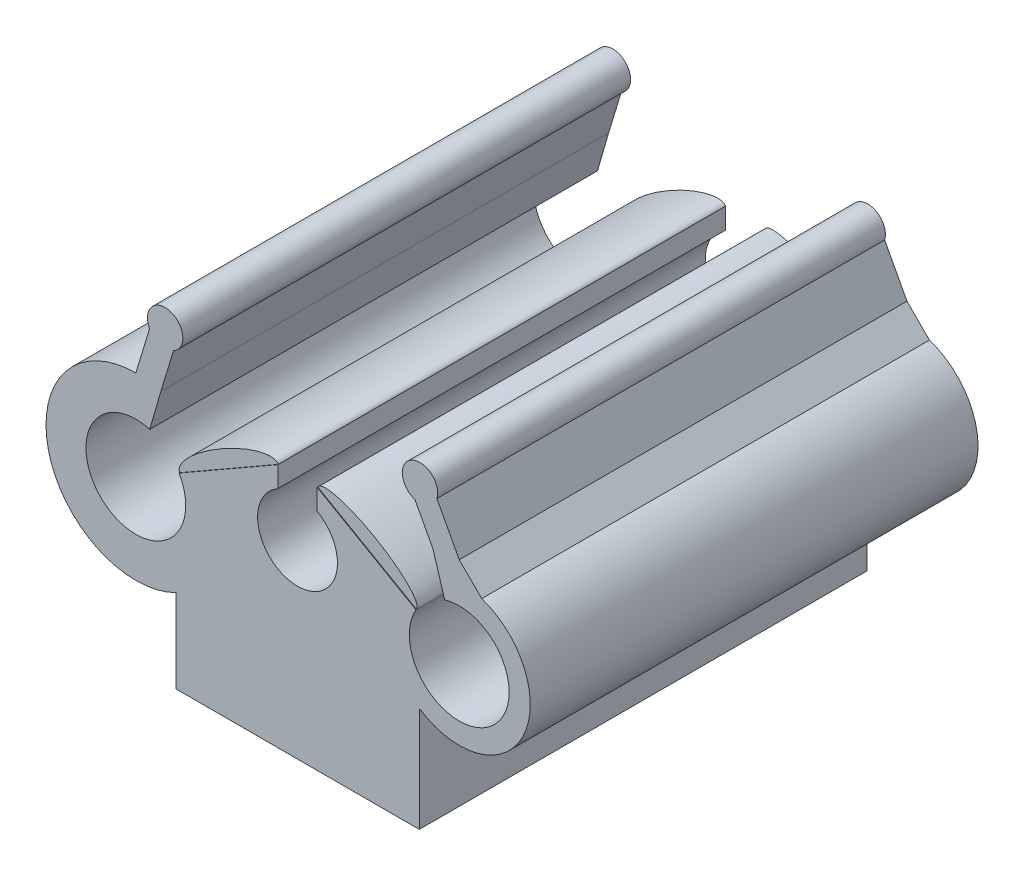
ISO-10303-21;
HEADER;
FILE_DESCRIPTION(('STEP AP214'),'2;1');
FILE_NAME('part.step','',(''),(''),'','','');
FILE_SCHEMA(('AUTOMOTIVE_DESIGN { 1 0 10303 214 1 1 1 1 }'));
ENDSEC;
DATA;
#1=APPLICATION_CONTEXT('core data for automotive mechanical design processes');
#2=APPLICATION_PROTOCOL_DEFINITION('international standard','automotive_design',2000,#1);
#3=PRODUCT_CONTEXT('',#1,'mechanical');
#4=PRODUCT('Part','Part','',(#3));
#5=PRODUCT_RELATED_PRODUCT_CATEGORY('part','',(#4));
#6=PRODUCT_DEFINITION_FORMATION('','',#4);
#7=PRODUCT_DEFINITION_CONTEXT('part definition',#1,'design');
#8=PRODUCT_DEFINITION('design','',#6,#7);
#9=PRODUCT_DEFINITION_SHAPE('','',#8);
#10=(LENGTH_UNIT() NAMED_UNIT(*) SI_UNIT(.MILLI.,.METRE.));
#11=(NAMED_UNIT(*) PLANE_ANGLE_UNIT() SI_UNIT($,.RADIAN.));
#12=(NAMED_UNIT(*) SI_UNIT($,.STERADIAN.) SOLID_ANGLE_UNIT());
#13=UNCERTAINTY_MEASURE_WITH_UNIT(LENGTH_MEASURE(1.E-05),#10,'distance_accuracy_value','');
#14=(GEOMETRIC_REPRESENTATION_CONTEXT(3) GLOBAL_UNCERTAINTY_ASSIGNED_CONTEXT((#13)) GLOBAL_UNIT_ASSIGNED_CONTEXT((#10,
#11,#12)) REPRESENTATION_CONTEXT('',''));
#15=CARTESIAN_POINT('',(0.,0.,0.));
#16=DIRECTION('',(0.,0.,1.));
#17=DIRECTION('',(1.,0.,0.));
#18=AXIS2_PLACEMENT_3D('',#15,#16,#17);
#19=CARTESIAN_POINT('',(-4.03325038650778,7.03417656127752,22.43));
#20=DIRECTION('',(-0.497414045158443,0.867513266572399,0.));
#21=DIRECTION('',(-0.867513266572399,-0.497414045158443,0.));
#22=AXIS2_PLACEMENT_3D('',#19,#20,#21);
#23=PLANE('',#22);
#24=DIRECTION('',(0.,0.,-1.));
#25=VECTOR('',#24,1.);
#26=CARTESIAN_POINT('',(5.11360878589365,12.2787951702992,22.43));
#27=LINE('',#26,#25);
#28=CARTESIAN_POINT('',(5.11360878589365,12.2787951702992,22.43));
#29=VERTEX_POINT('',#28);
#30=CARTESIAN_POINT('',(5.11360878589367,12.2787951702992,22.4));
#31=VERTEX_POINT('',#30);
#32=EDGE_CURVE('E53',#29,#31,#27,.T.);
#33=ORIENTED_EDGE('',*,*,#32,.T.);
#34=DIRECTION('',(-0.867513266572399,-0.497414045158444,0.));
#35=VECTOR('',#34,1.);
#36=CARTESIAN_POINT('',(5.11360878589367,12.2787951702992,22.4));
#37=LINE('',#36,#35);
#38=CARTESIAN_POINT('',(0.168783166430996,9.44353511289611,22.4));
#39=VERTEX_POINT('',#38);
#40=EDGE_CURVE('E374',#31,#39,#37,.T.);
#41=ORIENTED_EDGE('',*,*,#40,.T.);
#42=DIRECTION('',(0.,0.,-1.));
#43=VECTOR('',#42,1.);
#44=CARTESIAN_POINT('',(0.168783166431,9.4435351128961,22.43));
#45=LINE('',#44,#43);
#46=CARTESIAN_POINT('',(0.168783166431,9.4435351128961,22.43));
#47=VERTEX_POINT('',#46);
#48=EDGE_CURVE('E387',#47,#39,#45,.T.);
#49=ORIENTED_EDGE('',*,*,#48,.F.);
#50=DIRECTION('',(0.867513266572399,0.497414045158443,0.));
#51=VECTOR('',#50,1.);
#52=CARTESIAN_POINT('',(-4.03325038650778,7.03417656127752,22.43));
#53=LINE('',#52,#51);
#54=EDGE_CURVE('E467',#47,#29,#53,.T.);
#55=ORIENTED_EDGE('',*,*,#54,.T.);
#56=EDGE_LOOP('',(#33,#41,#49,#55));
#57=FACE_BOUND('',#56,.T.);
#58=ADVANCED_FACE('F43',(#57),#23,.T.);
#59=CARTESIAN_POINT('',(7.05178332082262,12.2986386157611,22.43));
#60=DIRECTION('',(0.497414045158445,0.867513266572398,0.));
#61=DIRECTION('',(-0.867513266572398,0.497414045158445,0.));
#62=AXIS2_PLACEMENT_3D('',#59,#60,#61);
#63=PLANE('',#62);
#64=DIRECTION('',(0.,0.,-1.));
#65=VECTOR('',#64,1.);
#66=CARTESIAN_POINT('',(12.031216833569,9.44353511289611,22.43));
#67=LINE('',#66,#65);
#68=CARTESIAN_POINT('',(12.031216833569,9.44353511289611,22.43));
#69=VERTEX_POINT('',#68);
#70=CARTESIAN_POINT('',(12.031216833569,9.44353511289611,22.4));
#71=VERTEX_POINT('',#70);
#72=EDGE_CURVE('E177',#69,#71,#67,.T.);
#73=ORIENTED_EDGE('',*,*,#72,.T.);
#74=DIRECTION('',(-0.867513266572399,0.497414045158443,0.));
#75=VECTOR('',#74,1.);
#76=CARTESIAN_POINT('',(12.031216833569,9.44353511289611,22.4));
#77=LINE('',#76,#75);
#78=CARTESIAN_POINT('',(7.08639121410632,12.2787951702992,22.4));
#79=VERTEX_POINT('',#78);
#80=EDGE_CURVE('E264',#71,#79,#77,.T.);
#81=ORIENTED_EDGE('',*,*,#80,.T.);
#82=DIRECTION('',(0.,0.,-1.));
#83=VECTOR('',#82,1.);
#84=CARTESIAN_POINT('',(7.08639121410632,12.2787951702992,22.43));
#85=LINE('',#84,#83);
#86=CARTESIAN_POINT('',(7.08639121410632,12.2787951702992,22.43));
#87=VERTEX_POINT('',#86);
#88=EDGE_CURVE('E188',#87,#79,#85,.T.);
#89=ORIENTED_EDGE('',*,*,#88,.F.);
#90=DIRECTION('',(0.867513266572398,-0.497414045158445,0.));
#91=VECTOR('',#90,1.);
#92=CARTESIAN_POINT('',(7.05178332082262,12.2986386157611,22.43));
#93=LINE('',#92,#91);
#94=EDGE_CURVE('E192',#87,#69,#93,.T.);
#95=ORIENTED_EDGE('',*,*,#94,.T.);
#96=EDGE_LOOP('',(#73,#81,#89,#95));
#97=FACE_BOUND('',#96,.T.);
#98=ADVANCED_FACE('F197',(#97),#63,.T.);
#99=CARTESIAN_POINT('',(6.1,9.5,22.43));
#100=DIRECTION('',(0.,0.,-1.));
#101=DIRECTION('',(-1.,0.,0.));
#102=AXIS2_PLACEMENT_3D('',#99,#100,#101);
#103=CYLINDRICAL_SURFACE('',#102,2.);
#104=CARTESIAN_POINT('',(6.1,9.5,0.));
#105=DIRECTION('',(0.,0.,1.));
#106=DIRECTION('',(1.,0.,0.));
#107=AXIS2_PLACEMENT_3D('',#104,#105,#106);
#108=CIRCLE('',#107,2.);
#109=CARTESIAN_POINT('',(5.11360878589367,11.2398368810707,0.));
#110=VERTEX_POINT('',#109);
#111=CARTESIAN_POINT('',(7.08639121410632,11.2398368810707,0.));
#112=VERTEX_POINT('',#111);
#113=EDGE_CURVE('E203',#110,#112,#108,.T.);
#114=ORIENTED_EDGE('',*,*,#113,.F.);
#115=DIRECTION('',(0.,0.,-1.));
#116=VECTOR('',#115,1.);
#117=CARTESIAN_POINT('',(5.11360878589367,11.2398368810707,22.43));
#118=LINE('',#117,#116);
#119=CARTESIAN_POINT('',(5.11360878589367,11.2398368810707,22.43));
#120=VERTEX_POINT('',#119);
#121=EDGE_CURVE('E11',#120,#110,#118,.T.);
#122=ORIENTED_EDGE('',*,*,#121,.F.);
#123=CARTESIAN_POINT('',(6.1,9.5,22.43));
#124=DIRECTION('',(0.,0.,1.));
#125=DIRECTION('',(1.,0.,0.));
#126=AXIS2_PLACEMENT_3D('',#123,#124,#125);
#127=CIRCLE('',#126,2.);
#128=CARTESIAN_POINT('',(7.08639121410632,11.2398368810707,22.43));
#129=VERTEX_POINT('',#128);
#130=EDGE_CURVE('E247',#120,#129,#127,.T.);
#131=ORIENTED_EDGE('',*,*,#130,.T.);
#132=DIRECTION('',(0.,0.,-1.));
#133=VECTOR('',#132,1.);
#134=CARTESIAN_POINT('',(7.08639121410632,11.2398368810707,22.43));
#135=LINE('',#134,#133);
#136=EDGE_CURVE('E123',#129,#112,#135,.T.);
#137=ORIENTED_EDGE('',*,*,#136,.T.);
#138=EDGE_LOOP('',(#114,#122,#131,#137));
#139=FACE_BOUND('',#138,.T.);
#140=ADVANCED_FACE('F45',(#139),#103,.F.);
#141=CARTESIAN_POINT('',(5.1136087858938,0.,22.43));
#142=DIRECTION('',(1.,0.,0.));
#143=DIRECTION('',(0.,1.,0.));
#144=AXIS2_PLACEMENT_3D('',#141,#142,#143);
#145=PLANE('',#144);
#146=DIRECTION('',(0.,-1.,0.));
#147=VECTOR('',#146,1.);
#148=CARTESIAN_POINT('',(5.1136087858938,0.,0.));
#149=LINE('',#148,#147);
#150=CARTESIAN_POINT('',(5.11360878589365,12.2787951702992,0.));
#151=VERTEX_POINT('',#150);
#152=EDGE_CURVE('E206',#151,#110,#149,.T.);
#153=ORIENTED_EDGE('',*,*,#152,.F.);
#154=DIRECTION('',(0.,0.,-1.));
#155=VECTOR('',#154,1.);
#156=CARTESIAN_POINT('',(5.11360878589367,12.2787951702992,22.4));
#157=LINE('',#156,#155);
#158=EDGE_CURVE('E358',#31,#151,#157,.T.);
#159=ORIENTED_EDGE('',*,*,#158,.F.);
#160=ORIENTED_EDGE('',*,*,#32,.F.);
#161=DIRECTION('',(0.,-1.,0.));
#162=VECTOR('',#161,1.);
#163=CARTESIAN_POINT('',(5.1136087858938,0.,22.43));
#164=LINE('',#163,#162);
#165=EDGE_CURVE('E466',#29,#120,#164,.T.);
#166=ORIENTED_EDGE('',*,*,#165,.T.);
#167=ORIENTED_EDGE('',*,*,#121,.T.);
#168=EDGE_LOOP('',(#153,#159,#160,#166,#167));
#169=FACE_BOUND('',#168,.T.);
#170=ADVANCED_FACE('F345',(#169),#145,.T.);
#171=CARTESIAN_POINT('',(-2.,8.2,22.43));
#172=DIRECTION('',(0.,0.,-1.));
#173=DIRECTION('',(-1.,0.,0.));
#174=AXIS2_PLACEMENT_3D('',#171,#172,#173);
#175=CYLINDRICAL_SURFACE('',#174,2.5);
#176=CARTESIAN_POINT('',(-2.,8.2,0.));
#177=DIRECTION('',(0.,0.,1.));
#178=DIRECTION('',(1.,0.,0.));
#179=AXIS2_PLACEMENT_3D('',#176,#177,#178);
#180=CIRCLE('',#179,2.5);
#181=CARTESIAN_POINT('',(-1.30427877412532,10.601243839319,0.));
#182=VERTEX_POINT('',#181);
#183=CARTESIAN_POINT('',(0.168783166430996,9.44353511289611,0.));
#184=VERTEX_POINT('',#183);
#185=EDGE_CURVE('E210',#182,#184,#180,.T.);
#186=ORIENTED_EDGE('',*,*,#185,.F.);
#187=DIRECTION('',(0.,0.,-1.));
#188=VECTOR('',#187,1.);
#189=CARTESIAN_POINT('',(-1.30427877412532,10.601243839319,22.43));
#190=LINE('',#189,#188);
#191=CARTESIAN_POINT('',(-1.30427877412532,10.601243839319,22.43));
#192=VERTEX_POINT('',#191);
#193=EDGE_CURVE('E393',#192,#182,#190,.T.);
#194=ORIENTED_EDGE('',*,*,#193,.F.);
#195=CARTESIAN_POINT('',(-2.,8.2,22.43));
#196=DIRECTION('',(0.,0.,1.));
#197=DIRECTION('',(1.,0.,0.));
#198=AXIS2_PLACEMENT_3D('',#195,#196,#197);
#199=CIRCLE('',#198,2.5);
#200=EDGE_CURVE('E472',#192,#47,#199,.T.);
#201=ORIENTED_EDGE('',*,*,#200,.T.);
#202=ORIENTED_EDGE('',*,*,#48,.T.);
#203=DIRECTION('',(0.,0.,-1.));
#204=VECTOR('',#203,1.);
#205=CARTESIAN_POINT('',(0.168783166430996,9.44353511289611,22.4));
#206=LINE('',#205,#204);
#207=EDGE_CURVE('E375',#39,#184,#206,.T.);
#208=ORIENTED_EDGE('',*,*,#207,.T.);
#209=EDGE_LOOP('',(#186,#194,#201,#202,#208));
#210=FACE_BOUND('',#209,.T.);
#211=ADVANCED_FACE('F341',(#210),#175,.F.);
#212=CARTESIAN_POINT('',(-4.03693338773731,1.16963558606675,22.43));
#213=DIRECTION('',(0.960497535727598,-0.278288490349873,0.));
#214=DIRECTION('',(0.278288490349873,0.960497535727598,0.));
#215=AXIS2_PLACEMENT_3D('',#212,#213,#214);
#216=PLANE('',#215);
#217=DIRECTION('',(-0.278288490349873,-0.960497535727598,0.));
#218=VECTOR('',#217,1.);
#219=CARTESIAN_POINT('',(-4.03693338773731,1.16963558606675,0.));
#220=LINE('',#219,#218);
#221=CARTESIAN_POINT('',(-0.74770179342557,12.5222389107742,0.));
#222=VERTEX_POINT('',#221);
#223=EDGE_CURVE('E213',#222,#182,#220,.T.);
#224=ORIENTED_EDGE('',*,*,#223,.F.);
#225=DIRECTION('',(0.,0.,-1.));
#226=VECTOR('',#225,1.);
#227=CARTESIAN_POINT('',(-0.74770179342557,12.5222389107742,22.43));
#228=LINE('',#227,#226);
#229=CARTESIAN_POINT('',(-0.74770179342557,12.5222389107742,22.43));
#230=VERTEX_POINT('',#229);
#231=EDGE_CURVE('E395',#230,#222,#228,.T.);
#232=ORIENTED_EDGE('',*,*,#231,.F.);
#233=DIRECTION('',(-0.278288490349873,-0.960497535727598,0.));
#234=VECTOR('',#233,1.);
#235=CARTESIAN_POINT('',(-4.03693338773731,1.16963558606675,22.43));
#236=LINE('',#235,#234);
#237=EDGE_CURVE('E475',#230,#192,#236,.T.);
#238=ORIENTED_EDGE('',*,*,#237,.T.);
#239=ORIENTED_EDGE('',*,*,#193,.T.);
#240=EDGE_LOOP('',(#224,#232,#238,#239));
#241=FACE_BOUND('',#240,.T.);
#242=ADVANCED_FACE('F337',(#241),#216,.T.);
#243=CARTESIAN_POINT('',(-4.16194643842174,1.2619481746162,22.43));
#244=DIRECTION('',(0.956976382752331,-0.290165819582983,0.));
#245=DIRECTION('',(0.290165819582983,0.956976382752331,0.));
#246=AXIS2_PLACEMENT_3D('',#243,#244,#245);
#247=PLANE('',#246);
#248=DIRECTION('',(-0.290165819582983,-0.956976382752331,0.));
#249=VECTOR('',#248,1.);
#250=CARTESIAN_POINT('',(-4.16194643842174,1.2619481746162,0.));
#251=LINE('',#250,#249);
#252=CARTESIAN_POINT('',(-0.115093584009334,14.6086015182537,0.));
#253=VERTEX_POINT('',#252);
#254=EDGE_CURVE('E216',#253,#222,#251,.T.);
#255=ORIENTED_EDGE('',*,*,#254,.F.);
#256=DIRECTION('',(0.,0.,-1.));
#257=VECTOR('',#256,1.);
#258=CARTESIAN_POINT('',(-0.115093584009334,14.6086015182537,22.43));
#259=LINE('',#258,#257);
#260=CARTESIAN_POINT('',(-0.115093584009334,14.6086015182537,22.43));
#261=VERTEX_POINT('',#260);
#262=EDGE_CURVE('E397',#261,#253,#259,.T.);
#263=ORIENTED_EDGE('',*,*,#262,.F.);
#264=DIRECTION('',(-0.290165819582983,-0.956976382752331,0.));
#265=VECTOR('',#264,1.);
#266=CARTESIAN_POINT('',(-4.16194643842174,1.2619481746162,22.43));
#267=LINE('',#266,#265);
#268=EDGE_CURVE('E478',#261,#230,#267,.T.);
#269=ORIENTED_EDGE('',*,*,#268,.T.);
#270=ORIENTED_EDGE('',*,*,#231,.T.);
#271=EDGE_LOOP('',(#255,#263,#269,#270));
#272=FACE_BOUND('',#271,.T.);
#273=ADVANCED_FACE('F333',(#272),#247,.T.);
#274=CARTESIAN_POINT('',(-0.531392302030844,15.3895755110176,22.43));
#275=DIRECTION('',(0.,0.,-1.));
#276=DIRECTION('',(-1.,0.,0.));
#277=AXIS2_PLACEMENT_3D('',#274,#275,#276);
#278=CYLINDRICAL_SURFACE('',#277,0.885);
#279=CARTESIAN_POINT('',(-0.531392302030844,15.3895755110176,0.));
#280=DIRECTION('',(0.,0.,1.));
#281=DIRECTION('',(1.,0.,0.));
#282=AXIS2_PLACEMENT_3D('',#279,#280,#281);
#283=CIRCLE('',#282,0.885);
#284=CARTESIAN_POINT('',(-1.31131406244975,14.9713087927324,0.));
#285=VERTEX_POINT('',#284);
#286=EDGE_CURVE('E219',#253,#285,#283,.T.);
#287=ORIENTED_EDGE('',*,*,#286,.T.);
#288=DIRECTION('',(0.,0.,-1.));
#289=VECTOR('',#288,1.);
#290=CARTESIAN_POINT('',(-1.31131406244975,14.9713087927324,22.43));
#291=LINE('',#290,#289);
#292=CARTESIAN_POINT('',(-1.31131406244975,14.9713087927324,22.43));
#293=VERTEX_POINT('',#292);
#294=EDGE_CURVE('E399',#293,#285,#291,.T.);
#295=ORIENTED_EDGE('',*,*,#294,.F.);
#296=CARTESIAN_POINT('',(-0.531392302030844,15.3895755110176,22.43));
#297=DIRECTION('',(0.,0.,1.));
#298=DIRECTION('',(1.,0.,0.));
#299=AXIS2_PLACEMENT_3D('',#296,#297,#298);
#300=CIRCLE('',#299,0.885);
#301=EDGE_CURVE('E481',#261,#293,#300,.T.);
#302=ORIENTED_EDGE('',*,*,#301,.F.);
#303=ORIENTED_EDGE('',*,*,#262,.T.);
#304=EDGE_LOOP('',(#287,#295,#302,#303));
#305=FACE_BOUND('',#304,.T.);
#306=ADVANCED_FACE('F329',(#305),#278,.T.);
#307=CARTESIAN_POINT('',(-5.35816691686216,1.62465544909494,22.43));
#308=DIRECTION('',(-0.956976382752331,0.290165819582983,0.));
#309=DIRECTION('',(-0.290165819582983,-0.956976382752331,0.));
#310=AXIS2_PLACEMENT_3D('',#307,#308,#309);
#311=PLANE('',#310);
#312=DIRECTION('',(0.290165819582983,0.956976382752331,0.));
#313=VECTOR('',#312,1.);
#314=CARTESIAN_POINT('',(-5.35816691686216,1.62465544909494,0.));
#315=LINE('',#314,#313);
#316=CARTESIAN_POINT('',(-2.,12.7,0.));
#317=VERTEX_POINT('',#316);
#318=EDGE_CURVE('E222',#317,#285,#315,.T.);
#319=ORIENTED_EDGE('',*,*,#318,.F.);
#320=DIRECTION('',(0.,0.,-1.));
#321=VECTOR('',#320,1.);
#322=CARTESIAN_POINT('',(-2.,12.7,22.43));
#323=LINE('',#322,#321);
#324=CARTESIAN_POINT('',(-2.,12.7,22.43));
#325=VERTEX_POINT('',#324);
#326=EDGE_CURVE('E401',#325,#317,#323,.T.);
#327=ORIENTED_EDGE('',*,*,#326,.F.);
#328=DIRECTION('',(0.290165819582983,0.956976382752331,0.));
#329=VECTOR('',#328,1.);
#330=CARTESIAN_POINT('',(-5.35816691686216,1.62465544909494,22.43));
#331=LINE('',#330,#329);
#332=EDGE_CURVE('E483',#325,#293,#331,.T.);
#333=ORIENTED_EDGE('',*,*,#332,.T.);
#334=ORIENTED_EDGE('',*,*,#294,.T.);
#335=EDGE_LOOP('',(#319,#327,#333,#334));
#336=FACE_BOUND('',#335,.T.);
#337=ADVANCED_FACE('F325',(#336),#311,.T.);
#338=CARTESIAN_POINT('',(-2.,8.2,22.43));
#339=DIRECTION('',(0.,0.,-1.));
#340=DIRECTION('',(-1.,0.,0.));
#341=AXIS2_PLACEMENT_3D('',#338,#339,#340);
#342=CYLINDRICAL_SURFACE('',#341,4.5);
#343=CARTESIAN_POINT('',(-2.,8.2,0.));
#344=DIRECTION('',(0.,0.,1.));
#345=DIRECTION('',(1.,0.,0.));
#346=AXIS2_PLACEMENT_3D('',#343,#344,#345);
#347=CIRCLE('',#346,4.5);
#348=CARTESIAN_POINT('',(0.,4.16887112585072,0.));
#349=VERTEX_POINT('',#348);
#350=EDGE_CURVE('E225',#317,#349,#347,.T.);
#351=ORIENTED_EDGE('',*,*,#350,.T.);
#352=DIRECTION('',(0.,0.,-1.));
#353=VECTOR('',#352,1.);
#354=CARTESIAN_POINT('',(0.,4.16887112585072,22.43));
#355=LINE('',#354,#353);
#356=CARTESIAN_POINT('',(0.,4.16887112585072,22.43));
#357=VERTEX_POINT('',#356);
#358=EDGE_CURVE('E403',#357,#349,#355,.T.);
#359=ORIENTED_EDGE('',*,*,#358,.F.);
#360=CARTESIAN_POINT('',(-2.,8.2,22.43));
#361=DIRECTION('',(0.,0.,1.));
#362=DIRECTION('',(1.,0.,0.));
#363=AXIS2_PLACEMENT_3D('',#360,#361,#362);
#364=CIRCLE('',#363,4.5);
#365=EDGE_CURVE('E486',#325,#357,#364,.T.);
#366=ORIENTED_EDGE('',*,*,#365,.F.);
#367=ORIENTED_EDGE('',*,*,#326,.T.);
#368=EDGE_LOOP('',(#351,#359,#366,#367));
#369=FACE_BOUND('',#368,.T.);
#370=ADVANCED_FACE('F321',(#369),#342,.T.);
#371=CARTESIAN_POINT('',(0.,0.,22.43));
#372=DIRECTION('',(1.,0.,0.));
#373=DIRECTION('',(0.,0.,-1.));
#374=AXIS2_PLACEMENT_3D('',#371,#372,#373);
#375=PLANE('',#374);
#376=DIRECTION('',(0.,-1.,0.));
#377=VECTOR('',#376,1.);
#378=CARTESIAN_POINT('',(0.,0.,0.));
#379=LINE('',#378,#377);
#380=CARTESIAN_POINT('',(0.,0.,0.));
#381=VERTEX_POINT('',#380);
#382=EDGE_CURVE('E227',#349,#381,#379,.T.);
#383=ORIENTED_EDGE('',*,*,#382,.T.);
#384=DIRECTION('',(0.,0.,-1.));
#385=VECTOR('',#384,1.);
#386=CARTESIAN_POINT('',(0.,0.,22.43));
#387=LINE('',#386,#385);
#388=CARTESIAN_POINT('',(0.,0.,22.43));
#389=VERTEX_POINT('',#388);
#390=EDGE_CURVE('E406',#389,#381,#387,.T.);
#391=ORIENTED_EDGE('',*,*,#390,.F.);
#392=DIRECTION('',(0.,-1.,0.));
#393=VECTOR('',#392,1.);
#394=CARTESIAN_POINT('',(0.,0.,22.43));
#395=LINE('',#394,#393);
#396=EDGE_CURVE('E488',#357,#389,#395,.T.);
#397=ORIENTED_EDGE('',*,*,#396,.F.);
#398=ORIENTED_EDGE('',*,*,#358,.T.);
#399=EDGE_LOOP('',(#383,#391,#397,#398));
#400=FACE_BOUND('',#399,.T.);
#401=ADVANCED_FACE('F317',(#400),#375,.F.);
#402=CARTESIAN_POINT('',(0.,0.,22.43));
#403=DIRECTION('',(0.,1.,0.));
#404=DIRECTION('',(0.,0.,1.));
#405=AXIS2_PLACEMENT_3D('',#402,#403,#404);
#406=PLANE('',#405);
#407=DIRECTION('',(1.,0.,0.));
#408=VECTOR('',#407,1.);
#409=CARTESIAN_POINT('',(0.,0.,0.));
#410=LINE('',#409,#408);
#411=CARTESIAN_POINT('',(12.2,0.,0.));
#412=VERTEX_POINT('',#411);
#413=EDGE_CURVE('E229',#381,#412,#410,.T.);
#414=ORIENTED_EDGE('',*,*,#413,.T.);
#415=DIRECTION('',(0.,0.,-1.));
#416=VECTOR('',#415,1.);
#417=CARTESIAN_POINT('',(12.2,0.,22.43));
#418=LINE('',#417,#416);
#419=CARTESIAN_POINT('',(12.2,0.,22.43));
#420=VERTEX_POINT('',#419);
#421=EDGE_CURVE('E409',#420,#412,#418,.T.);
#422=ORIENTED_EDGE('',*,*,#421,.F.);
#423=DIRECTION('',(1.,0.,0.));
#424=VECTOR('',#423,1.);
#425=CARTESIAN_POINT('',(0.,0.,22.43));
#426=LINE('',#425,#424);
#427=EDGE_CURVE('E490',#389,#420,#426,.T.);
#428=ORIENTED_EDGE('',*,*,#427,.F.);
#429=ORIENTED_EDGE('',*,*,#390,.T.);
#430=EDGE_LOOP('',(#414,#422,#428,#429));
#431=FACE_BOUND('',#430,.T.);
#432=ADVANCED_FACE('F313',(#431),#406,.F.);
#433=CARTESIAN_POINT('',(12.2,0.,22.43));
#434=DIRECTION('',(-1.,0.,0.));
#435=DIRECTION('',(0.,0.,1.));
#436=AXIS2_PLACEMENT_3D('',#433,#434,#435);
#437=PLANE('',#436);
#438=DIRECTION('',(0.,1.,0.));
#439=VECTOR('',#438,1.);
#440=CARTESIAN_POINT('',(12.2,0.,0.));
#441=LINE('',#440,#439);
#442=CARTESIAN_POINT('',(12.2,5.25772202477504,0.));
#443=VERTEX_POINT('',#442);
#444=EDGE_CURVE('E231',#412,#443,#441,.T.);
#445=ORIENTED_EDGE('',*,*,#444,.T.);
#446=DIRECTION('',(0.,0.,-1.));
#447=VECTOR('',#446,1.);
#448=CARTESIAN_POINT('',(12.2,5.25772202477504,22.5));
#449=LINE('',#448,#447);
#450=CARTESIAN_POINT('',(12.2,5.25772202477504,22.43));
#451=VERTEX_POINT('',#450);
#452=EDGE_CURVE('E504',#451,#443,#449,.T.);
#453=ORIENTED_EDGE('',*,*,#452,.F.);
#454=DIRECTION('',(0.,1.,0.));
#455=VECTOR('',#454,1.);
#456=CARTESIAN_POINT('',(12.2,0.,22.43));
#457=LINE('',#456,#455);
#458=EDGE_CURVE('E492',#420,#451,#457,.T.);
#459=ORIENTED_EDGE('',*,*,#458,.F.);
#460=ORIENTED_EDGE('',*,*,#421,.T.);
#461=EDGE_LOOP('',(#445,#453,#459,#460));
#462=FACE_BOUND('',#461,.T.);
#463=ADVANCED_FACE('F309',(#462),#437,.F.);
#464=CARTESIAN_POINT('',(16.3237903011189,8.72785459626649,22.43));
#465=DIRECTION('',(-0.881862708391386,-0.471506270953642,0.));
#466=DIRECTION('',(0.471506270953642,-0.881862708391386,0.));
#467=AXIS2_PLACEMENT_3D('',#464,#465,#466);
#468=PLANE('',#467);
#469=DIRECTION('',(-0.471506270953642,0.881862708391386,0.));
#470=VECTOR('',#469,1.);
#471=CARTESIAN_POINT('',(16.3237903011189,8.72785459626649,0.));
#472=LINE('',#471,#470);
#473=CARTESIAN_POINT('',(14.2,12.7,0.));
#474=VERTEX_POINT('',#473);
#475=CARTESIAN_POINT('',(13.0809166471116,14.7930323460977,0.));
#476=VERTEX_POINT('',#475);
#477=EDGE_CURVE('E234',#474,#476,#472,.T.);
#478=ORIENTED_EDGE('',*,*,#477,.T.);
#479=DIRECTION('',(0.,0.,-1.));
#480=VECTOR('',#479,1.);
#481=CARTESIAN_POINT('',(13.0809166471116,14.7930323460977,22.43));
#482=LINE('',#481,#480);
#483=CARTESIAN_POINT('',(13.0809166471116,14.7930323460977,22.43));
#484=VERTEX_POINT('',#483);
#485=EDGE_CURVE('E415',#484,#476,#482,.T.);
#486=ORIENTED_EDGE('',*,*,#485,.F.);
#487=DIRECTION('',(-0.471506270953642,0.881862708391386,0.));
#488=VECTOR('',#487,1.);
#489=CARTESIAN_POINT('',(16.3237903011189,8.72785459626649,22.43));
#490=LINE('',#489,#488);
#491=CARTESIAN_POINT('',(14.2,12.7,22.43));
#492=VERTEX_POINT('',#491);
#493=EDGE_CURVE('E435',#492,#484,#490,.T.);
#494=ORIENTED_EDGE('',*,*,#493,.F.);
#495=DIRECTION('',(0.,0.,-1.));
#496=VECTOR('',#495,1.);
#497=CARTESIAN_POINT('',(14.2,12.7,22.43));
#498=LINE('',#497,#496);
#499=EDGE_CURVE('E412',#492,#474,#498,.T.);
#500=ORIENTED_EDGE('',*,*,#499,.T.);
#501=EDGE_LOOP('',(#478,#486,#494,#500));
#502=FACE_BOUND('',#501,.T.);
#503=ADVANCED_FACE('F305',(#502),#468,.F.);
#504=CARTESIAN_POINT('',(12.2343169943945,15.0508967058281,22.43));
#505=DIRECTION('',(0.,0.,-1.));
#506=DIRECTION('',(-1.,0.,0.));
#507=AXIS2_PLACEMENT_3D('',#504,#505,#506);
#508=CYLINDRICAL_SURFACE('',#507,0.885000000000001);
#509=CARTESIAN_POINT('',(12.2343169943945,15.0508967058281,0.));
#510=DIRECTION('',(0.,0.,1.));
#511=DIRECTION('',(1.,0.,0.));
#512=AXIS2_PLACEMENT_3D('',#509,#510,#511);
#513=CIRCLE('',#512,0.885000000000001);
#514=CARTESIAN_POINT('',(11.9785882616224,14.2036495074056,0.));
#515=VERTEX_POINT('',#514);
#516=EDGE_CURVE('E236',#476,#515,#513,.T.);
#517=ORIENTED_EDGE('',*,*,#516,.T.);
#518=DIRECTION('',(0.,0.,-1.));
#519=VECTOR('',#518,1.);
#520=CARTESIAN_POINT('',(11.9785882616224,14.2036495074056,22.43));
#521=LINE('',#520,#519);
#522=CARTESIAN_POINT('',(11.9785882616224,14.2036495074056,22.43));
#523=VERTEX_POINT('',#522);
#524=EDGE_CURVE('E418',#523,#515,#521,.T.);
#525=ORIENTED_EDGE('',*,*,#524,.F.);
#526=CARTESIAN_POINT('',(12.2343169943945,15.0508967058281,22.43));
#527=DIRECTION('',(0.,0.,1.));
#528=DIRECTION('',(1.,0.,0.));
#529=AXIS2_PLACEMENT_3D('',#526,#527,#528);
#530=CIRCLE('',#529,0.885000000000001);
#531=EDGE_CURVE('E431',#484,#523,#530,.T.);
#532=ORIENTED_EDGE('',*,*,#531,.F.);
#533=ORIENTED_EDGE('',*,*,#485,.T.);
#534=EDGE_LOOP('',(#517,#525,#532,#533));
#535=FACE_BOUND('',#534,.T.);
#536=ADVANCED_FACE('F301',(#535),#508,.T.);
#537=CARTESIAN_POINT('',(15.2214619156296,8.13847175757446,22.43));
#538=DIRECTION('',(0.881862708391386,0.471506270953643,0.));
#539=DIRECTION('',(-0.471506270953643,0.881862708391386,0.));
#540=AXIS2_PLACEMENT_3D('',#537,#538,#539);
#541=PLANE('',#540);
#542=DIRECTION('',(0.471506270953643,-0.881862708391386,0.));
#543=VECTOR('',#542,1.);
#544=CARTESIAN_POINT('',(15.2214619156296,8.13847175757446,0.));
#545=LINE('',#544,#543);
#546=CARTESIAN_POINT('',(12.8872071836223,12.5042508083599,0.));
#547=VERTEX_POINT('',#546);
#548=EDGE_CURVE('E238',#515,#547,#545,.T.);
#549=ORIENTED_EDGE('',*,*,#548,.T.);
#550=DIRECTION('',(0.,0.,-1.));
#551=VECTOR('',#550,1.);
#552=CARTESIAN_POINT('',(12.8872071836223,12.5042508083599,22.43));
#553=LINE('',#552,#551);
#554=CARTESIAN_POINT('',(12.8872071836223,12.5042508083599,22.43));
#555=VERTEX_POINT('',#554);
#556=EDGE_CURVE('E421',#555,#547,#553,.T.);
#557=ORIENTED_EDGE('',*,*,#556,.F.);
#558=DIRECTION('',(0.471506270953643,-0.881862708391386,0.));
#559=VECTOR('',#558,1.);
#560=CARTESIAN_POINT('',(15.2214619156296,8.13847175757446,22.43));
#561=LINE('',#560,#559);
#562=EDGE_CURVE('E429',#523,#555,#561,.T.);
#563=ORIENTED_EDGE('',*,*,#562,.F.);
#564=ORIENTED_EDGE('',*,*,#524,.T.);
#565=EDGE_LOOP('',(#549,#557,#563,#564));
#566=FACE_BOUND('',#565,.T.);
#567=ADVANCED_FACE('F297',(#566),#541,.F.);
#568=CARTESIAN_POINT('',(15.2796147920512,4.66026944737135,22.43));
#569=DIRECTION('',(0.95650017963554,0.291731736972822,0.));
#570=DIRECTION('',(-0.291731736972822,0.95650017963554,0.));
#571=AXIS2_PLACEMENT_3D('',#568,#569,#570);
#572=PLANE('',#571);
#573=DIRECTION('',(0.291731736972822,-0.95650017963554,0.));
#574=VECTOR('',#573,1.);
#575=CARTESIAN_POINT('',(15.2796147920512,4.66026944737135,0.));
#576=LINE('',#575,#574);
#577=CARTESIAN_POINT('',(13.4706706575679,10.5912504490889,0.));
#578=VERTEX_POINT('',#577);
#579=EDGE_CURVE('E240',#547,#578,#576,.T.);
#580=ORIENTED_EDGE('',*,*,#579,.T.);
#581=DIRECTION('',(0.,0.,-1.));
#582=VECTOR('',#581,1.);
#583=CARTESIAN_POINT('',(13.4706706575679,10.5912504490889,22.43));
#584=LINE('',#583,#582);
#585=CARTESIAN_POINT('',(13.4706706575679,10.5912504490889,22.43));
#586=VERTEX_POINT('',#585);
#587=EDGE_CURVE('E187',#586,#578,#584,.T.);
#588=ORIENTED_EDGE('',*,*,#587,.F.);
#589=DIRECTION('',(0.291731736972822,-0.95650017963554,0.));
#590=VECTOR('',#589,1.);
#591=CARTESIAN_POINT('',(15.2796147920512,4.66026944737135,22.43));
#592=LINE('',#591,#590);
#593=EDGE_CURVE('E194',#555,#586,#592,.T.);
#594=ORIENTED_EDGE('',*,*,#593,.F.);
#595=ORIENTED_EDGE('',*,*,#556,.T.);
#596=EDGE_LOOP('',(#580,#588,#594,#595));
#597=FACE_BOUND('',#596,.T.);
#598=ADVANCED_FACE('F294',(#597),#572,.F.);
#599=CARTESIAN_POINT('',(14.2,8.2,22.43));
#600=DIRECTION('',(0.,0.,-1.));
#601=DIRECTION('',(-1.,0.,0.));
#602=AXIS2_PLACEMENT_3D('',#599,#600,#601);
#603=CYLINDRICAL_SURFACE('',#602,2.5);
#604=CARTESIAN_POINT('',(14.2,8.2,0.));
#605=DIRECTION('',(0.,0.,1.));
#606=DIRECTION('',(1.,0.,0.));
#607=AXIS2_PLACEMENT_3D('',#604,#605,#606);
#608=CIRCLE('',#607,2.5);
#609=CARTESIAN_POINT('',(12.031216833569,9.44353511289611,0.));
#610=VERTEX_POINT('',#609);
#611=EDGE_CURVE('E243',#610,#578,#608,.T.);
#612=ORIENTED_EDGE('',*,*,#611,.F.);
#613=DIRECTION('',(0.,0.,-1.));
#614=VECTOR('',#613,1.);
#615=CARTESIAN_POINT('',(12.031216833569,9.44353511289611,22.4));
#616=LINE('',#615,#614);
#617=EDGE_CURVE('E183',#71,#610,#616,.T.);
#618=ORIENTED_EDGE('',*,*,#617,.F.);
#619=ORIENTED_EDGE('',*,*,#72,.F.);
#620=CARTESIAN_POINT('',(14.2,8.2,22.43));
#621=DIRECTION('',(0.,0.,1.));
#622=DIRECTION('',(1.,0.,0.));
#623=AXIS2_PLACEMENT_3D('',#620,#621,#622);
#624=CIRCLE('',#623,2.5);
#625=EDGE_CURVE('E181',#69,#586,#624,.T.);
#626=ORIENTED_EDGE('',*,*,#625,.T.);
#627=ORIENTED_EDGE('',*,*,#587,.T.);
#628=EDGE_LOOP('',(#612,#618,#619,#626,#627));
#629=FACE_BOUND('',#628,.T.);
#630=ADVANCED_FACE('F180',(#629),#603,.F.);
#631=CARTESIAN_POINT('',(7.08639121410632,0.,22.43));
#632=DIRECTION('',(1.,0.,0.));
#633=DIRECTION('',(0.,0.,-1.));
#634=AXIS2_PLACEMENT_3D('',#631,#632,#633);
#635=PLANE('',#634);
#636=DIRECTION('',(0.,-1.,0.));
#637=VECTOR('',#636,1.);
#638=CARTESIAN_POINT('',(7.08639121410632,0.,0.));
#639=LINE('',#638,#637);
#640=CARTESIAN_POINT('',(7.08639121410632,12.2787951702992,0.));
#641=VERTEX_POINT('',#640);
#642=EDGE_CURVE('E245',#641,#112,#639,.T.);
#643=ORIENTED_EDGE('',*,*,#642,.T.);
#644=ORIENTED_EDGE('',*,*,#136,.F.);
#645=DIRECTION('',(0.,-1.,0.));
#646=VECTOR('',#645,1.);
#647=CARTESIAN_POINT('',(7.08639121410632,0.,22.43));
#648=LINE('',#647,#646);
#649=EDGE_CURVE('E62',#87,#129,#648,.T.);
#650=ORIENTED_EDGE('',*,*,#649,.F.);
#651=ORIENTED_EDGE('',*,*,#88,.T.);
#652=DIRECTION('',(0.,0.,-1.));
#653=VECTOR('',#652,1.);
#654=CARTESIAN_POINT('',(7.08639121410632,12.2787951702992,22.4));
#655=LINE('',#654,#653);
#656=EDGE_CURVE('E207',#79,#641,#655,.T.);
#657=ORIENTED_EDGE('',*,*,#656,.T.);
#658=EDGE_LOOP('',(#643,#644,#650,#651,#657));
#659=FACE_BOUND('',#658,.T.);
#660=ADVANCED_FACE('F284',(#659),#635,.F.);
#661=CARTESIAN_POINT('',(0.,0.,22.43));
#662=DIRECTION('',(0.,0.,1.));
#663=DIRECTION('',(1.,0.,0.));
#664=AXIS2_PLACEMENT_3D('',#661,#662,#663);
#665=PLANE('',#664);
#666=DIRECTION('',(0.707106781186541,-0.707106781186554,0.));
#667=VECTOR('',#666,1.);
#668=CARTESIAN_POINT('',(13.4500000000001,13.4499999999999,22.43));
#669=LINE('',#668,#667);
#670=CARTESIAN_POINT('',(15.3248334160014,11.5751665839986,22.43));
#671=VERTEX_POINT('',#670);
#672=EDGE_CURVE('E378',#492,#671,#669,.T.);
#673=ORIENTED_EDGE('',*,*,#672,.F.);
#674=ORIENTED_EDGE('',*,*,#493,.T.);
#675=ORIENTED_EDGE('',*,*,#531,.T.);
#676=ORIENTED_EDGE('',*,*,#562,.T.);
#677=ORIENTED_EDGE('',*,*,#593,.T.);
#678=ORIENTED_EDGE('',*,*,#625,.F.);
#679=ORIENTED_EDGE('',*,*,#94,.F.);
#680=ORIENTED_EDGE('',*,*,#649,.T.);
#681=ORIENTED_EDGE('',*,*,#130,.F.);
#682=ORIENTED_EDGE('',*,*,#165,.F.);
#683=ORIENTED_EDGE('',*,*,#54,.F.);
#684=ORIENTED_EDGE('',*,*,#200,.F.);
#685=ORIENTED_EDGE('',*,*,#237,.F.);
#686=ORIENTED_EDGE('',*,*,#268,.F.);
#687=ORIENTED_EDGE('',*,*,#301,.T.);
#688=ORIENTED_EDGE('',*,*,#332,.F.);
#689=ORIENTED_EDGE('',*,*,#365,.T.);
#690=ORIENTED_EDGE('',*,*,#396,.T.);
#691=ORIENTED_EDGE('',*,*,#427,.T.);
#692=ORIENTED_EDGE('',*,*,#458,.T.);
#693=CARTESIAN_POINT('',(14.2,8.2,22.43));
#694=DIRECTION('',(0.,0.,1.));
#695=DIRECTION('',(1.,0.,0.));
#696=AXIS2_PLACEMENT_3D('',#693,#694,#695);
#697=CIRCLE('',#696,3.55766773090095);
#698=EDGE_CURVE('E498',#671,#451,#697,.F.);
#699=ORIENTED_EDGE('',*,*,#698,.F.);
#700=EDGE_LOOP('',(#673,#674,#675,#676,#677,#678,#679,#680,#681,#682,#683,#684,#685,#686,#687,
#688,#689,#690,#691,#692,#699));
#701=FACE_BOUND('',#700,.T.);
#702=ADVANCED_FACE('F191',(#701),#665,.T.);
#703=CARTESIAN_POINT('',(0.,0.,0.));
#704=DIRECTION('',(0.,0.,1.));
#705=DIRECTION('',(1.,0.,0.));
#706=AXIS2_PLACEMENT_3D('',#703,#704,#705);
#707=PLANE('',#706);
#708=ORIENTED_EDGE('',*,*,#477,.F.);
#709=DIRECTION('',(-0.707106781186542,0.707106781186554,0.));
#710=VECTOR('',#709,1.);
#711=CARTESIAN_POINT('',(14.2,12.7,0.));
#712=LINE('',#711,#710);
#713=CARTESIAN_POINT('',(15.3248334160014,11.5751665839986,0.));
#714=VERTEX_POINT('',#713);
#715=EDGE_CURVE('E442',#714,#474,#712,.T.);
#716=ORIENTED_EDGE('',*,*,#715,.F.);
#717=CARTESIAN_POINT('',(14.2,8.2,0.));
#718=DIRECTION('',(0.,0.,1.));
#719=DIRECTION('',(-1.,0.,0.));
#720=AXIS2_PLACEMENT_3D('',#717,#718,#719);
#721=CIRCLE('',#720,3.55766773090095);
#722=EDGE_CURVE('E509',#443,#714,#721,.T.);
#723=ORIENTED_EDGE('',*,*,#722,.F.);
#724=ORIENTED_EDGE('',*,*,#444,.F.);
#725=ORIENTED_EDGE('',*,*,#413,.F.);
#726=ORIENTED_EDGE('',*,*,#382,.F.);
#727=ORIENTED_EDGE('',*,*,#350,.F.);
#728=ORIENTED_EDGE('',*,*,#318,.T.);
#729=ORIENTED_EDGE('',*,*,#286,.F.);
#730=ORIENTED_EDGE('',*,*,#254,.T.);
#731=ORIENTED_EDGE('',*,*,#223,.T.);
#732=ORIENTED_EDGE('',*,*,#185,.T.);
#733=CARTESIAN_POINT('',(2.64119597616233,10.8611651415977,0.));
#734=DIRECTION('',(0.,0.,-1.));
#735=DIRECTION('',(-0.867513266572399,-0.497414045158444,0.));
#736=AXIS2_PLACEMENT_3D('',#733,#734,#735);
#737=ELLIPSE('',#736,2.85,0.769958840809105);
#738=EDGE_CURVE('E363',#184,#151,#737,.T.);
#739=ORIENTED_EDGE('',*,*,#738,.T.);
#740=ORIENTED_EDGE('',*,*,#152,.T.);
#741=ORIENTED_EDGE('',*,*,#113,.T.);
#742=ORIENTED_EDGE('',*,*,#642,.F.);
#743=CARTESIAN_POINT('',(9.55880402383766,10.8611651415977,0.));
#744=DIRECTION('',(0.,0.,-1.));
#745=DIRECTION('',(-0.867513266572399,0.497414045158443,0.));
#746=AXIS2_PLACEMENT_3D('',#743,#744,#745);
#747=ELLIPSE('',#746,2.85,0.772022221071091);
#748=EDGE_CURVE('E116',#641,#610,#747,.T.);
#749=ORIENTED_EDGE('',*,*,#748,.T.);
#750=ORIENTED_EDGE('',*,*,#611,.T.);
#751=ORIENTED_EDGE('',*,*,#579,.F.);
#752=ORIENTED_EDGE('',*,*,#548,.F.);
#753=ORIENTED_EDGE('',*,*,#516,.F.);
#754=EDGE_LOOP('',(#708,#716,#723,#724,#725,#726,#727,#728,#729,#730,#731,#732,#739,#740,#741,
#742,#749,#750,#751,#752,#753));
#755=FACE_BOUND('',#754,.T.);
#756=ADVANCED_FACE('F279',(#755),#707,.F.);
#757=CARTESIAN_POINT('',(9.55880402383766,10.8611651415977,22.4));
#758=DIRECTION('',(0.,0.,-1.));
#759=DIRECTION('',(-0.867513266572399,0.497414045158443,0.));
#760=AXIS2_PLACEMENT_3D('',#757,#758,#759);
#761=ELLIPSE('',#760,2.85,0.772022221071091);
#762=DIRECTION('',(0.,0.,-1.));
#763=VECTOR('',#762,1.);
#764=SURFACE_OF_LINEAR_EXTRUSION('',#761,#763);
#765=ORIENTED_EDGE('',*,*,#748,.F.);
#766=ORIENTED_EDGE('',*,*,#656,.F.);
#767=EDGE_CURVE('E260',#79,#71,#761,.T.);
#768=ORIENTED_EDGE('',*,*,#767,.T.);
#769=ORIENTED_EDGE('',*,*,#617,.T.);
#770=EDGE_LOOP('',(#765,#766,#768,#769));
#771=FACE_BOUND('',#770,.T.);
#772=ADVANCED_FACE('F274',(#771),#764,.T.);
#773=CARTESIAN_POINT('',(9.55880402383766,10.8611651415977,22.4));
#774=DIRECTION('',(0.,0.,-1.));
#775=DIRECTION('',(-1.,0.,0.));
#776=AXIS2_PLACEMENT_3D('',#773,#774,#775);
#777=PLANE('',#776);
#778=ORIENTED_EDGE('',*,*,#767,.F.);
#779=ORIENTED_EDGE('',*,*,#80,.F.);
#780=EDGE_LOOP('',(#778,#779));
#781=FACE_BOUND('',#780,.T.);
#782=ADVANCED_FACE('F278',(#781),#777,.F.);
#783=CARTESIAN_POINT('',(2.64119597616233,10.8611651415977,22.4));
#784=DIRECTION('',(0.,0.,-1.));
#785=DIRECTION('',(-0.867513266572399,-0.497414045158444,0.));
#786=AXIS2_PLACEMENT_3D('',#783,#784,#785);
#787=ELLIPSE('',#786,2.85,0.769958840809105);
#788=DIRECTION('',(0.,0.,-1.));
#789=VECTOR('',#788,1.);
#790=SURFACE_OF_LINEAR_EXTRUSION('',#787,#789);
#791=ORIENTED_EDGE('',*,*,#738,.F.);
#792=ORIENTED_EDGE('',*,*,#207,.F.);
#793=EDGE_CURVE('E369',#39,#31,#787,.T.);
#794=ORIENTED_EDGE('',*,*,#793,.T.);
#795=ORIENTED_EDGE('',*,*,#158,.T.);
#796=EDGE_LOOP('',(#791,#792,#794,#795));
#797=FACE_BOUND('',#796,.T.);
#798=ADVANCED_FACE('F371',(#797),#790,.T.);
#799=CARTESIAN_POINT('',(2.64119597616233,10.8611651415977,22.4));
#800=DIRECTION('',(0.,0.,-1.));
#801=DIRECTION('',(-1.,0.,0.));
#802=AXIS2_PLACEMENT_3D('',#799,#800,#801);
#803=PLANE('',#802);
#804=ORIENTED_EDGE('',*,*,#793,.F.);
#805=ORIENTED_EDGE('',*,*,#40,.F.);
#806=EDGE_LOOP('',(#804,#805));
#807=FACE_BOUND('',#806,.T.);
#808=ADVANCED_FACE('F537',(#807),#803,.F.);
#809=CARTESIAN_POINT('',(14.2,12.7,22.5));
#810=DIRECTION('',(-0.707106781186554,-0.707106781186541,0.));
#811=DIRECTION('',(0.707106781186541,-0.707106781186554,0.));
#812=AXIS2_PLACEMENT_3D('',#809,#810,#811);
#813=PLANE('',#812);
#814=ORIENTED_EDGE('',*,*,#672,.T.);
#815=DIRECTION('',(0.,0.,-1.));
#816=VECTOR('',#815,1.);
#817=CARTESIAN_POINT('',(15.3248334160014,11.5751665839986,22.5));
#818=LINE('',#817,#816);
#819=EDGE_CURVE('E501',#671,#714,#818,.T.);
#820=ORIENTED_EDGE('',*,*,#819,.T.);
#821=ORIENTED_EDGE('',*,*,#715,.T.);
#822=ORIENTED_EDGE('',*,*,#499,.F.);
#823=EDGE_LOOP('',(#814,#820,#821,#822));
#824=FACE_BOUND('',#823,.T.);
#825=ADVANCED_FACE('F540',(#824),#813,.F.);
#826=CARTESIAN_POINT('',(14.2,8.2,22.5));
#827=DIRECTION('',(0.,0.,-1.));
#828=DIRECTION('',(-1.,0.,0.));
#829=AXIS2_PLACEMENT_3D('',#826,#827,#828);
#830=CYLINDRICAL_SURFACE('',#829,3.55766773090095);
#831=ORIENTED_EDGE('',*,*,#698,.T.);
#832=ORIENTED_EDGE('',*,*,#452,.T.);
#833=ORIENTED_EDGE('',*,*,#722,.T.);
#834=ORIENTED_EDGE('',*,*,#819,.F.);
#835=EDGE_LOOP('',(#831,#832,#833,#834));
#836=FACE_BOUND('',#835,.T.);
#837=ADVANCED_FACE('F512',(#836),#830,.T.);
#838=CLOSED_SHELL('',(#58,#98,#140,#170,#211,#242,#273,#306,#337,#370,#401,#432,#463,#503,#536,
#567,#598,#630,#660,#702,#756,#772,#782,#798,#808,#825,#837));
#839=MANIFOLD_SOLID_BREP('B2',#838);
#840=ADVANCED_BREP_SHAPE_REPRESENTATION('',(#18,#839),#14);
#841=SHAPE_DEFINITION_REPRESENTATION(#9,#840);
ENDSEC;
END-ISO-10303-21;
